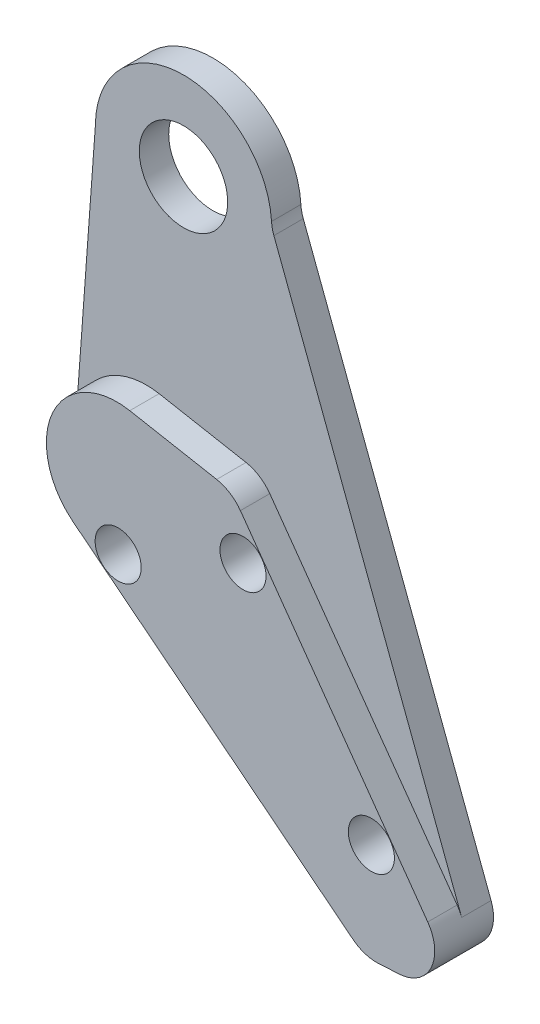
ISO-10303-21;
HEADER;
FILE_DESCRIPTION(('STEP AP214'),'2;1');
FILE_NAME('part.step','',(''),(''),'','','');
FILE_SCHEMA(('AUTOMOTIVE_DESIGN { 1 0 10303 214 1 1 1 1 }'));
ENDSEC;
DATA;
#1=APPLICATION_CONTEXT('core data for automotive mechanical design processes');
#2=APPLICATION_PROTOCOL_DEFINITION('international standard','automotive_design',2000,#1);
#3=PRODUCT_CONTEXT('',#1,'mechanical');
#4=PRODUCT('Part','Part','',(#3));
#5=PRODUCT_RELATED_PRODUCT_CATEGORY('part','',(#4));
#6=PRODUCT_DEFINITION_FORMATION('','',#4);
#7=PRODUCT_DEFINITION_CONTEXT('part definition',#1,'design');
#8=PRODUCT_DEFINITION('design','',#6,#7);
#9=PRODUCT_DEFINITION_SHAPE('','',#8);
#10=(LENGTH_UNIT() NAMED_UNIT(*) SI_UNIT(.MILLI.,.METRE.));
#11=(NAMED_UNIT(*) PLANE_ANGLE_UNIT() SI_UNIT($,.RADIAN.));
#12=(NAMED_UNIT(*) SI_UNIT($,.STERADIAN.) SOLID_ANGLE_UNIT());
#13=UNCERTAINTY_MEASURE_WITH_UNIT(LENGTH_MEASURE(1.E-05),#10,'distance_accuracy_value','');
#14=(GEOMETRIC_REPRESENTATION_CONTEXT(3) GLOBAL_UNCERTAINTY_ASSIGNED_CONTEXT((#13)) GLOBAL_UNIT_ASSIGNED_CONTEXT((#10,
#11,#12)) REPRESENTATION_CONTEXT('',''));
#15=CARTESIAN_POINT('',(0.,0.,0.));
#16=DIRECTION('',(0.,0.,1.));
#17=DIRECTION('',(1.,0.,0.));
#18=AXIS2_PLACEMENT_3D('',#15,#16,#17);
#19=CARTESIAN_POINT('',(66.6622604325006,359.5194560744,3.175));
#20=DIRECTION('',(-0.182312910473785,-0.983240561955505,0.));
#21=DIRECTION('',(0.983240561955505,-0.182312910473785,0.));
#22=AXIS2_PLACEMENT_3D('',#19,#20,#21);
#23=PLANE('',#22);
#24=DIRECTION('',(-0.983240561955505,0.182312910473785,0.));
#25=VECTOR('',#24,1.);
#26=CARTESIAN_POINT('',(66.6622604325006,359.5194560744,3.175));
#27=LINE('',#26,#25);
#28=CARTESIAN_POINT('',(355.83164898947,305.901537034429,3.175));
#29=VERTEX_POINT('',#28);
#30=CARTESIAN_POINT('',(346.443481491415,307.642295305408,3.175));
#31=VERTEX_POINT('',#30);
#32=EDGE_CURVE('E194',#29,#31,#27,.T.);
#33=ORIENTED_EDGE('',*,*,#32,.F.);
#34=DIRECTION('',(0.,0.,-1.));
#35=VECTOR('',#34,1.);
#36=CARTESIAN_POINT('',(355.83164898947,305.901537034429,3.175));
#37=LINE('',#36,#35);
#38=CARTESIAN_POINT('',(355.83164898947,305.901537034429,0.));
#39=VERTEX_POINT('',#38);
#40=EDGE_CURVE('E220',#29,#39,#37,.T.);
#41=ORIENTED_EDGE('',*,*,#40,.T.);
#42=DIRECTION('',(-0.983240561955505,0.182312910473785,0.));
#43=VECTOR('',#42,1.);
#44=CARTESIAN_POINT('',(66.6622604325006,359.5194560744,0.));
#45=LINE('',#44,#43);
#46=CARTESIAN_POINT('',(346.443481491415,307.642295305408,0.));
#47=VERTEX_POINT('',#46);
#48=EDGE_CURVE('E146',#39,#47,#45,.T.);
#49=ORIENTED_EDGE('',*,*,#48,.T.);
#50=DIRECTION('',(0.,0.,-1.));
#51=VECTOR('',#50,1.);
#52=CARTESIAN_POINT('',(346.443481491415,307.642295305408,3.175));
#53=LINE('',#52,#51);
#54=EDGE_CURVE('E217',#31,#47,#53,.T.);
#55=ORIENTED_EDGE('',*,*,#54,.F.);
#56=EDGE_LOOP('',(#33,#41,#49,#55));
#57=FACE_BOUND('',#56,.T.);
#58=ADVANCED_FACE('F37',(#57),#23,.F.);
#59=CARTESIAN_POINT('',(345.054257113605,300.150002223307,3.175));
#60=DIRECTION('',(0.,0.,-1.));
#61=DIRECTION('',(-1.,0.,0.));
#62=AXIS2_PLACEMENT_3D('',#59,#60,#61);
#63=CYLINDRICAL_SURFACE('',#62,7.61999999999995);
#64=CARTESIAN_POINT('',(345.054257113605,300.150002223307,0.));
#65=DIRECTION('',(0.,0.,1.));
#66=DIRECTION('',(1.,0.,0.));
#67=AXIS2_PLACEMENT_3D('',#64,#65,#66);
#68=CIRCLE('',#67,7.61999999999995);
#69=CARTESIAN_POINT('',(337.454724492493,300.708127604065,0.));
#70=VERTEX_POINT('',#69);
#71=EDGE_CURVE('E211',#47,#70,#68,.T.);
#72=ORIENTED_EDGE('',*,*,#71,.T.);
#73=DIRECTION('',(0.,0.,1.));
#74=VECTOR('',#73,1.);
#75=CARTESIAN_POINT('',(337.454724492493,300.708127604065,-3.175));
#76=LINE('',#75,#74);
#77=CARTESIAN_POINT('',(337.454724492493,300.708127604065,-3.175));
#78=VERTEX_POINT('',#77);
#79=EDGE_CURVE('E147',#78,#70,#76,.T.);
#80=ORIENTED_EDGE('',*,*,#79,.F.);
#81=CARTESIAN_POINT('',(345.054257113605,300.150002223307,-3.175));
#82=DIRECTION('',(0.,0.,-1.));
#83=DIRECTION('',(-1.,0.,0.));
#84=AXIS2_PLACEMENT_3D('',#81,#82,#83);
#85=CIRCLE('',#84,7.61999999999995);
#86=CARTESIAN_POINT('',(340.323801551131,294.176126582531,-3.175));
#87=VERTEX_POINT('',#86);
#88=EDGE_CURVE('E176',#87,#78,#85,.T.);
#89=ORIENTED_EDGE('',*,*,#88,.F.);
#90=DIRECTION('',(0.,0.,-1.));
#91=VECTOR('',#90,1.);
#92=CARTESIAN_POINT('',(340.323801551131,294.176126582531,3.175));
#93=LINE('',#92,#91);
#94=CARTESIAN_POINT('',(340.323801551131,294.176126582531,3.175));
#95=VERTEX_POINT('',#94);
#96=EDGE_CURVE('E208',#95,#87,#93,.T.);
#97=ORIENTED_EDGE('',*,*,#96,.F.);
#98=CARTESIAN_POINT('',(345.054257113605,300.150002223307,3.175));
#99=DIRECTION('',(0.,0.,1.));
#100=DIRECTION('',(1.,0.,0.));
#101=AXIS2_PLACEMENT_3D('',#98,#99,#100);
#102=CIRCLE('',#101,7.61999999999995);
#103=EDGE_CURVE('E196',#31,#95,#102,.T.);
#104=ORIENTED_EDGE('',*,*,#103,.F.);
#105=ORIENTED_EDGE('',*,*,#54,.T.);
#106=EDGE_LOOP('',(#72,#80,#89,#97,#104,#105));
#107=FACE_BOUND('',#106,.T.);
#108=ADVANCED_FACE('F274',(#107),#63,.T.);
#109=CARTESIAN_POINT('',(274.327563220316,346.435713404767,3.175));
#110=DIRECTION('',(-0.620794693238081,-0.783973181204202,0.));
#111=DIRECTION('',(0.783973181204202,-0.620794693238081,0.));
#112=AXIS2_PLACEMENT_3D('',#109,#110,#111);
#113=PLANE('',#112);
#114=ORIENTED_EDGE('',*,*,#96,.T.);
#115=DIRECTION('',(-0.783973181204203,0.620794693238081,0.));
#116=VECTOR('',#115,1.);
#117=CARTESIAN_POINT('',(274.327563220316,346.435713404767,-3.175));
#118=LINE('',#117,#116);
#119=CARTESIAN_POINT('',(370.573160939073,270.222957989389,-3.175));
#120=VERTEX_POINT('',#119);
#121=EDGE_CURVE('E173',#120,#87,#118,.T.);
#122=ORIENTED_EDGE('',*,*,#121,.F.);
#123=DIRECTION('',(0.,0.,-1.));
#124=VECTOR('',#123,1.);
#125=CARTESIAN_POINT('',(370.573160939073,270.222957989389,3.175));
#126=LINE('',#125,#124);
#127=CARTESIAN_POINT('',(370.573160939073,270.222957989389,3.175));
#128=VERTEX_POINT('',#127);
#129=EDGE_CURVE('E241',#120,#128,#126,.F.);
#130=ORIENTED_EDGE('',*,*,#129,.T.);
#131=DIRECTION('',(-0.783973181204202,0.620794693238081,0.));
#132=VECTOR('',#131,1.);
#133=CARTESIAN_POINT('',(274.327563220316,346.435713404767,3.175));
#134=LINE('',#133,#132);
#135=EDGE_CURVE('E200',#128,#95,#134,.T.);
#136=ORIENTED_EDGE('',*,*,#135,.T.);
#137=EDGE_LOOP('',(#114,#122,#130,#136));
#138=FACE_BOUND('',#137,.T.);
#139=ADVANCED_FACE('F280',(#138),#113,.T.);
#140=CARTESIAN_POINT('',(-14.1819989275817,247.112078193795,3.175));
#141=DIRECTION('',(-0.0572966760156146,0.998357196056382,0.));
#142=DIRECTION('',(-0.998357196056382,-0.0572966760156146,0.));
#143=AXIS2_PLACEMENT_3D('',#140,#141,#142);
#144=PLANE('',#143);
#145=DIRECTION('',(0.998357196056382,0.0572966760156146,0.));
#146=VECTOR('',#145,1.);
#147=CARTESIAN_POINT('',(-14.1819989275817,247.112078193795,3.175));
#148=LINE('',#147,#146);
#149=CARTESIAN_POINT('',(373.32892426372,269.35170135303,3.175));
#150=VERTEX_POINT('',#149);
#151=CARTESIAN_POINT('',(375.564558347033,269.48000653505,3.175));
#152=VERTEX_POINT('',#151);
#153=EDGE_CURVE('E202',#150,#152,#148,.T.);
#154=ORIENTED_EDGE('',*,*,#153,.F.);
#155=DIRECTION('',(0.,0.,-1.));
#156=VECTOR('',#155,1.);
#157=CARTESIAN_POINT('',(373.32892426372,269.35170135303,0.));
#158=LINE('',#157,#156);
#159=CARTESIAN_POINT('',(373.32892426372,269.35170135303,-3.175));
#160=VERTEX_POINT('',#159);
#161=EDGE_CURVE('E239',#150,#160,#158,.T.);
#162=ORIENTED_EDGE('',*,*,#161,.T.);
#163=DIRECTION('',(-0.998357196056382,-0.0572966760156146,0.));
#164=VECTOR('',#163,1.);
#165=CARTESIAN_POINT('',(-14.1819989275817,247.112078193795,-3.175));
#166=LINE('',#165,#164);
#167=CARTESIAN_POINT('',(375.564558347033,269.48000653505,-3.175));
#168=VERTEX_POINT('',#167);
#169=EDGE_CURVE('E156',#168,#160,#166,.T.);
#170=ORIENTED_EDGE('',*,*,#169,.F.);
#171=DIRECTION('',(0.,0.,-1.));
#172=VECTOR('',#171,1.);
#173=CARTESIAN_POINT('',(375.564558347033,269.48000653505,3.175));
#174=LINE('',#173,#172);
#175=EDGE_CURVE('E153',#168,#152,#174,.F.);
#176=ORIENTED_EDGE('',*,*,#175,.T.);
#177=EDGE_LOOP('',(#154,#162,#170,#176));
#178=FACE_BOUND('',#177,.T.);
#179=ADVANCED_FACE('F323',(#178),#144,.F.);
#180=CARTESIAN_POINT('',(381.351836094849,272.096968274889,3.175));
#181=DIRECTION('',(-0.814033418596933,-0.580818038121571,0.));
#182=DIRECTION('',(0.580818038121571,-0.814033418596933,0.));
#183=AXIS2_PLACEMENT_3D('',#180,#181,#182);
#184=PLANE('',#183);
#185=DIRECTION('',(-0.580818038121571,0.814033418596933,0.));
#186=VECTOR('',#185,1.);
#187=CARTESIAN_POINT('',(381.351836094849,272.096968274889,0.));
#188=LINE('',#187,#186);
#189=CARTESIAN_POINT('',(378.639936468883,275.897774686749,0.));
#190=VERTEX_POINT('',#189);
#191=CARTESIAN_POINT('',(358.398961134483,304.266091897568,0.));
#192=VERTEX_POINT('',#191);
#193=EDGE_CURVE('E197',#190,#192,#188,.T.);
#194=ORIENTED_EDGE('',*,*,#193,.T.);
#195=DIRECTION('',(0.,0.,-1.));
#196=VECTOR('',#195,1.);
#197=CARTESIAN_POINT('',(358.398961134483,304.266091897568,3.175));
#198=LINE('',#197,#196);
#199=CARTESIAN_POINT('',(358.398961134483,304.266091897568,3.175));
#200=VERTEX_POINT('',#199);
#201=EDGE_CURVE('E230',#192,#200,#198,.F.);
#202=ORIENTED_EDGE('',*,*,#201,.T.);
#203=DIRECTION('',(-0.580818038121571,0.814033418596933,0.));
#204=VECTOR('',#203,1.);
#205=CARTESIAN_POINT('',(381.351836094849,272.096968274889,3.175));
#206=LINE('',#205,#204);
#207=CARTESIAN_POINT('',(378.639936468883,275.897774686749,3.175));
#208=VERTEX_POINT('',#207);
#209=EDGE_CURVE('E205',#208,#200,#206,.T.);
#210=ORIENTED_EDGE('',*,*,#209,.F.);
#211=DIRECTION('',(0.,0.,-1.));
#212=VECTOR('',#211,1.);
#213=CARTESIAN_POINT('',(378.639936468883,275.897774686749,3.175));
#214=LINE('',#213,#212);
#215=EDGE_CURVE('E227',#208,#190,#214,.T.);
#216=ORIENTED_EDGE('',*,*,#215,.T.);
#217=EDGE_LOOP('',(#194,#202,#210,#216));
#218=FACE_BOUND('',#217,.T.);
#219=ADVANCED_FACE('F319',(#218),#184,.F.);
#220=CARTESIAN_POINT('',(0.,0.,3.175));
#221=DIRECTION('',(0.,0.,1.));
#222=DIRECTION('',(1.,0.,0.));
#223=AXIS2_PLACEMENT_3D('',#220,#221,#222);
#224=PLANE('',#223);
#225=CARTESIAN_POINT('',(358.677915578042,299.501986691275,3.175));
#226=DIRECTION('',(0.,0.,1.));
#227=DIRECTION('',(1.,0.,0.));
#228=AXIS2_PLACEMENT_3D('',#225,#226,#227);
#229=CIRCLE('',#228,2.48920000000001);
#230=CARTESIAN_POINT('',(361.167115578042,299.501986691275,3.175));
#231=VERTEX_POINT('',#230);
#232=EDGE_CURVE('E459',#231,#231,#229,.T.);
#233=ORIENTED_EDGE('',*,*,#232,.F.);
#234=EDGE_LOOP('',(#233));
#235=FACE_BOUND('',#234,.T.);
#236=CARTESIAN_POINT('',(372.548956234398,280.061318695652,3.175));
#237=DIRECTION('',(0.,0.,1.));
#238=DIRECTION('',(1.,0.,0.));
#239=AXIS2_PLACEMENT_3D('',#236,#237,#238);
#240=CIRCLE('',#239,2.48920000000001);
#241=CARTESIAN_POINT('',(375.038156234398,280.061318695652,3.175));
#242=VERTEX_POINT('',#241);
#243=EDGE_CURVE('E464',#242,#242,#240,.T.);
#244=ORIENTED_EDGE('',*,*,#243,.F.);
#245=EDGE_LOOP('',(#244));
#246=FACE_BOUND('',#245,.T.);
#247=CARTESIAN_POINT('',(345.192347420864,293.560840943581,3.175));
#248=DIRECTION('',(0.,0.,1.));
#249=DIRECTION('',(1.,0.,0.));
#250=AXIS2_PLACEMENT_3D('',#247,#248,#249);
#251=CIRCLE('',#250,2.48920000000001);
#252=CARTESIAN_POINT('',(347.681547420864,293.560840943581,3.175));
#253=VERTEX_POINT('',#252);
#254=EDGE_CURVE('E166',#253,#253,#251,.T.);
#255=ORIENTED_EDGE('',*,*,#254,.F.);
#256=EDGE_LOOP('',(#255));
#257=FACE_BOUND('',#256,.T.);
#258=ORIENTED_EDGE('',*,*,#209,.T.);
#259=CARTESIAN_POINT('',(355.090729321305,301.905647390642,3.175));
#260=DIRECTION('',(0.,0.,1.));
#261=DIRECTION('',(1.,0.,0.));
#262=AXIS2_PLACEMENT_3D('',#259,#260,#261);
#263=CIRCLE('',#262,4.064);
#264=EDGE_CURVE('E236',#200,#29,#263,.T.);
#265=ORIENTED_EDGE('',*,*,#264,.T.);
#266=ORIENTED_EDGE('',*,*,#32,.T.);
#267=ORIENTED_EDGE('',*,*,#103,.T.);
#268=ORIENTED_EDGE('',*,*,#135,.F.);
#269=CARTESIAN_POINT('',(373.096070572392,273.409024997803,3.175));
#270=DIRECTION('',(0.,0.,1.));
#271=DIRECTION('',(1.,0.,0.));
#272=AXIS2_PLACEMENT_3D('',#269,#270,#271);
#273=CIRCLE('',#272,4.064);
#274=EDGE_CURVE('E234',#128,#150,#273,.T.);
#275=ORIENTED_EDGE('',*,*,#274,.T.);
#276=ORIENTED_EDGE('',*,*,#153,.T.);
#277=CARTESIAN_POINT('',(375.331704655705,273.537330179823,3.175));
#278=DIRECTION('',(0.,0.,1.));
#279=DIRECTION('',(1.,0.,0.));
#280=AXIS2_PLACEMENT_3D('',#277,#278,#279);
#281=CIRCLE('',#280,4.064);
#282=EDGE_CURVE('E232',#152,#208,#281,.T.);
#283=ORIENTED_EDGE('',*,*,#282,.T.);
#284=EDGE_LOOP('',(#258,#265,#266,#267,#268,#275,#276,#283));
#285=FACE_BOUND('',#284,.T.);
#286=ADVANCED_FACE('F290',(#235,#246,#257,#285),#224,.T.);
#287=CARTESIAN_POINT('',(355.090729321305,301.905647390642,3.175));
#288=DIRECTION('',(0.,0.,-1.));
#289=DIRECTION('',(-1.,0.,0.));
#290=AXIS2_PLACEMENT_3D('',#287,#288,#289);
#291=CYLINDRICAL_SURFACE('',#290,4.064);
#292=ORIENTED_EDGE('',*,*,#264,.F.);
#293=ORIENTED_EDGE('',*,*,#201,.F.);
#294=CARTESIAN_POINT('',(355.090729321305,301.905647390642,0.));
#295=DIRECTION('',(0.,0.,1.));
#296=DIRECTION('',(1.,0.,0.));
#297=AXIS2_PLACEMENT_3D('',#294,#295,#296);
#298=CIRCLE('',#297,4.064);
#299=EDGE_CURVE('E225',#39,#192,#298,.F.);
#300=ORIENTED_EDGE('',*,*,#299,.F.);
#301=ORIENTED_EDGE('',*,*,#40,.F.);
#302=EDGE_LOOP('',(#292,#293,#300,#301));
#303=FACE_BOUND('',#302,.T.);
#304=ADVANCED_FACE('F286',(#303),#291,.T.);
#305=CARTESIAN_POINT('',(373.096070572392,273.409024997803,3.175));
#306=DIRECTION('',(0.,0.,1.));
#307=DIRECTION('',(1.,0.,0.));
#308=AXIS2_PLACEMENT_3D('',#305,#306,#307);
#309=CYLINDRICAL_SURFACE('',#308,4.064);
#310=ORIENTED_EDGE('',*,*,#274,.F.);
#311=ORIENTED_EDGE('',*,*,#129,.F.);
#312=CARTESIAN_POINT('',(373.096070572392,273.409024997803,-3.175));
#313=DIRECTION('',(0.,0.,-1.));
#314=DIRECTION('',(-1.,0.,0.));
#315=AXIS2_PLACEMENT_3D('',#312,#313,#314);
#316=CIRCLE('',#315,4.064);
#317=EDGE_CURVE('E170',#160,#120,#316,.T.);
#318=ORIENTED_EDGE('',*,*,#317,.F.);
#319=ORIENTED_EDGE('',*,*,#161,.F.);
#320=EDGE_LOOP('',(#310,#311,#318,#319));
#321=FACE_BOUND('',#320,.T.);
#322=ADVANCED_FACE('F289',(#321),#309,.T.);
#323=CARTESIAN_POINT('',(375.331704655705,273.537330179823,3.175));
#324=DIRECTION('',(0.,0.,-1.));
#325=DIRECTION('',(-1.,0.,0.));
#326=AXIS2_PLACEMENT_3D('',#323,#324,#325);
#327=CYLINDRICAL_SURFACE('',#326,4.064);
#328=ORIENTED_EDGE('',*,*,#282,.F.);
#329=ORIENTED_EDGE('',*,*,#175,.F.);
#330=CARTESIAN_POINT('',(375.331704655705,273.537330179823,-3.175));
#331=DIRECTION('',(0.,0.,-1.));
#332=DIRECTION('',(-1.,0.,0.));
#333=AXIS2_PLACEMENT_3D('',#330,#331,#332);
#334=CIRCLE('',#333,4.064);
#335=CARTESIAN_POINT('',(379.132945264584,274.97492046687,-3.175));
#336=VERTEX_POINT('',#335);
#337=EDGE_CURVE('E150',#336,#168,#334,.T.);
#338=ORIENTED_EDGE('',*,*,#337,.F.);
#339=DIRECTION('',(0.,0.,1.));
#340=VECTOR('',#339,1.);
#341=CARTESIAN_POINT('',(379.132945264584,274.97492046687,-3.175));
#342=LINE('',#341,#340);
#343=CARTESIAN_POINT('',(379.132945264584,274.97492046687,0.));
#344=VERTEX_POINT('',#343);
#345=EDGE_CURVE('E138',#336,#344,#342,.T.);
#346=ORIENTED_EDGE('',*,*,#345,.T.);
#347=CARTESIAN_POINT('',(375.331704655705,273.537330179823,0.));
#348=DIRECTION('',(0.,0.,1.));
#349=DIRECTION('',(1.,0.,0.));
#350=AXIS2_PLACEMENT_3D('',#347,#348,#349);
#351=CIRCLE('',#350,4.064);
#352=EDGE_CURVE('E223',#190,#344,#351,.F.);
#353=ORIENTED_EDGE('',*,*,#352,.F.);
#354=ORIENTED_EDGE('',*,*,#215,.F.);
#355=EDGE_LOOP('',(#328,#329,#338,#346,#353,#354));
#356=FACE_BOUND('',#355,.T.);
#357=ADVANCED_FACE('F152',(#356),#327,.T.);
#358=CARTESIAN_POINT('',(0.,0.,0.));
#359=DIRECTION('',(0.,0.,-1.));
#360=DIRECTION('',(-1.,0.,0.));
#361=AXIS2_PLACEMENT_3D('',#358,#359,#360);
#362=PLANE('',#361);
#363=CARTESIAN_POINT('',(349.076836415497,329.262769658404,0.));
#364=DIRECTION('',(0.,0.,-1.));
#365=DIRECTION('',(-1.,0.,0.));
#366=AXIS2_PLACEMENT_3D('',#363,#364,#365);
#367=CIRCLE('',#366,4.77519999999998);
#368=CARTESIAN_POINT('',(344.301636415497,329.262769658404,0.));
#369=VERTEX_POINT('',#368);
#370=EDGE_CURVE('E160',#369,#369,#367,.T.);
#371=ORIENTED_EDGE('',*,*,#370,.T.);
#372=EDGE_LOOP('',(#371));
#373=FACE_BOUND('',#372,.T.);
#374=ORIENTED_EDGE('',*,*,#193,.F.);
#375=ORIENTED_EDGE('',*,*,#352,.T.);
#376=DIRECTION('',(-0.353737767482172,0.935344638011428,0.));
#377=VECTOR('',#376,1.);
#378=CARTESIAN_POINT('',(422.671936221158,159.850199616382,0.));
#379=LINE('',#378,#377);
#380=CARTESIAN_POINT('',(358.840666954011,328.631259867459,0.));
#381=VERTEX_POINT('',#380);
#382=EDGE_CURVE('E143',#344,#381,#379,.T.);
#383=ORIENTED_EDGE('',*,*,#382,.T.);
#384=CARTESIAN_POINT('',(362.641907562889,330.068850154507,0.));
#385=DIRECTION('',(0.,0.,-1.));
#386=DIRECTION('',(-1.,0.,0.));
#387=AXIS2_PLACEMENT_3D('',#384,#385,#386);
#388=CIRCLE('',#387,4.064);
#389=CARTESIAN_POINT('',(358.585063855258,329.827779351934,0.));
#390=VERTEX_POINT('',#389);
#391=EDGE_CURVE('E45',#381,#390,#388,.T.);
#392=ORIENTED_EDGE('',*,*,#391,.T.);
#393=CARTESIAN_POINT('',(349.076836415497,329.262769658404,0.));
#394=DIRECTION('',(0.,0.,-1.));
#395=DIRECTION('',(-1.,0.,0.));
#396=AXIS2_PLACEMENT_3D('',#393,#394,#395);
#397=CIRCLE('',#396,9.52500000000002);
#398=CARTESIAN_POINT('',(339.552515105864,329.376473619938,0.));
#399=VERTEX_POINT('',#398);
#400=EDGE_CURVE('E163',#399,#390,#397,.T.);
#401=ORIENTED_EDGE('',*,*,#400,.F.);
#402=CARTESIAN_POINT('',(335.488804680421,329.424987310193,0.));
#403=DIRECTION('',(0.,0.,-1.));
#404=DIRECTION('',(-1.,0.,0.));
#405=AXIS2_PLACEMENT_3D('',#402,#403,#404);
#406=CIRCLE('',#405,4.064);
#407=CARTESIAN_POINT('',(339.541888745014,329.127320440455,0.));
#408=VERTEX_POINT('',#407);
#409=EDGE_CURVE('E252',#399,#408,#406,.T.);
#410=ORIENTED_EDGE('',*,*,#409,.T.);
#411=DIRECTION('',(-0.0732448006244585,-0.997313992271984,0.));
#412=VECTOR('',#411,1.);
#413=CARTESIAN_POINT('',(313.678200402227,-23.0371752795325,0.));
#414=LINE('',#413,#412);
#415=EDGE_CURVE('E187',#408,#70,#414,.T.);
#416=ORIENTED_EDGE('',*,*,#415,.T.);
#417=ORIENTED_EDGE('',*,*,#71,.F.);
#418=ORIENTED_EDGE('',*,*,#48,.F.);
#419=ORIENTED_EDGE('',*,*,#299,.T.);
#420=EDGE_LOOP('',(#374,#375,#383,#392,#401,#410,#416,#417,#418,#419));
#421=FACE_BOUND('',#420,.T.);
#422=ADVANCED_FACE('F257',(#373,#421),#362,.F.);
#423=CARTESIAN_POINT('',(422.671936221158,159.850199616382,-3.175));
#424=DIRECTION('',(0.935344638011428,0.353737767482172,0.));
#425=DIRECTION('',(-0.353737767482172,0.935344638011428,0.));
#426=AXIS2_PLACEMENT_3D('',#423,#424,#425);
#427=PLANE('',#426);
#428=DIRECTION('',(-0.353737767482172,0.935344638011428,0.));
#429=VECTOR('',#428,1.);
#430=CARTESIAN_POINT('',(422.671936221158,159.850199616382,-3.175));
#431=LINE('',#430,#429);
#432=CARTESIAN_POINT('',(358.840666954011,328.631259867459,-3.175));
#433=VERTEX_POINT('',#432);
#434=EDGE_CURVE('E141',#336,#433,#431,.T.);
#435=ORIENTED_EDGE('',*,*,#434,.T.);
#436=DIRECTION('',(0.,0.,1.));
#437=VECTOR('',#436,1.);
#438=CARTESIAN_POINT('',(358.840666954011,328.631259867459,-3.175));
#439=LINE('',#438,#437);
#440=EDGE_CURVE('E250',#433,#381,#439,.T.);
#441=ORIENTED_EDGE('',*,*,#440,.T.);
#442=ORIENTED_EDGE('',*,*,#382,.F.);
#443=ORIENTED_EDGE('',*,*,#345,.F.);
#444=EDGE_LOOP('',(#435,#441,#442,#443));
#445=FACE_BOUND('',#444,.T.);
#446=ADVANCED_FACE('F140',(#445),#427,.T.);
#447=CARTESIAN_POINT('',(313.678200402227,-23.0371752795325,-3.175));
#448=DIRECTION('',(-0.997313992271984,0.0732448006244585,0.));
#449=DIRECTION('',(-0.0732448006244585,-0.997313992271984,0.));
#450=AXIS2_PLACEMENT_3D('',#447,#448,#449);
#451=PLANE('',#450);
#452=ORIENTED_EDGE('',*,*,#415,.F.);
#453=DIRECTION('',(0.,0.,1.));
#454=VECTOR('',#453,1.);
#455=CARTESIAN_POINT('',(339.541888745014,329.127320440455,-3.175));
#456=LINE('',#455,#454);
#457=CARTESIAN_POINT('',(339.541888745014,329.127320440455,-3.175));
#458=VERTEX_POINT('',#457);
#459=EDGE_CURVE('E248',#408,#458,#456,.F.);
#460=ORIENTED_EDGE('',*,*,#459,.T.);
#461=DIRECTION('',(-0.0732448006244585,-0.997313992271984,0.));
#462=VECTOR('',#461,1.);
#463=CARTESIAN_POINT('',(313.678200402227,-23.0371752795325,-3.175));
#464=LINE('',#463,#462);
#465=EDGE_CURVE('E179',#458,#78,#464,.T.);
#466=ORIENTED_EDGE('',*,*,#465,.T.);
#467=ORIENTED_EDGE('',*,*,#79,.T.);
#468=EDGE_LOOP('',(#452,#460,#466,#467));
#469=FACE_BOUND('',#468,.T.);
#470=ADVANCED_FACE('F304',(#469),#451,.T.);
#471=CARTESIAN_POINT('',(349.076836415497,329.262769658404,-3.175));
#472=DIRECTION('',(0.,0.,1.));
#473=DIRECTION('',(1.,0.,0.));
#474=AXIS2_PLACEMENT_3D('',#471,#472,#473);
#475=CYLINDRICAL_SURFACE('',#474,9.52500000000002);
#476=CARTESIAN_POINT('',(349.076836415497,329.262769658404,-3.175));
#477=DIRECTION('',(0.,0.,-1.));
#478=DIRECTION('',(-1.,0.,0.));
#479=AXIS2_PLACEMENT_3D('',#476,#477,#478);
#480=CIRCLE('',#479,9.52500000000002);
#481=CARTESIAN_POINT('',(339.552515105864,329.376473619938,-3.175));
#482=VERTEX_POINT('',#481);
#483=CARTESIAN_POINT('',(358.585063855258,329.827779351934,-3.175));
#484=VERTEX_POINT('',#483);
#485=EDGE_CURVE('E181',#482,#484,#480,.T.);
#486=ORIENTED_EDGE('',*,*,#485,.F.);
#487=DIRECTION('',(0.,0.,1.));
#488=VECTOR('',#487,1.);
#489=CARTESIAN_POINT('',(339.552515105864,329.376473619938,-3.175));
#490=LINE('',#489,#488);
#491=EDGE_CURVE('E245',#482,#399,#490,.T.);
#492=ORIENTED_EDGE('',*,*,#491,.T.);
#493=ORIENTED_EDGE('',*,*,#400,.T.);
#494=DIRECTION('',(0.,0.,1.));
#495=VECTOR('',#494,1.);
#496=CARTESIAN_POINT('',(358.585063855258,329.827779351934,-3.175));
#497=LINE('',#496,#495);
#498=EDGE_CURVE('E243',#390,#484,#497,.F.);
#499=ORIENTED_EDGE('',*,*,#498,.T.);
#500=EDGE_LOOP('',(#486,#492,#493,#499));
#501=FACE_BOUND('',#500,.T.);
#502=ADVANCED_FACE('F260',(#501),#475,.T.);
#503=CARTESIAN_POINT('',(349.076836415497,329.262769658404,-3.175));
#504=DIRECTION('',(0.,0.,1.));
#505=DIRECTION('',(1.,0.,0.));
#506=AXIS2_PLACEMENT_3D('',#503,#504,#505);
#507=CYLINDRICAL_SURFACE('',#506,4.77519999999998);
#508=CARTESIAN_POINT('',(349.076836415497,329.262769658404,-3.175));
#509=DIRECTION('',(0.,0.,-1.));
#510=DIRECTION('',(-1.,0.,0.));
#511=AXIS2_PLACEMENT_3D('',#508,#509,#510);
#512=CIRCLE('',#511,4.77519999999998);
#513=CARTESIAN_POINT('',(344.301636415497,329.262769658404,-3.175));
#514=VERTEX_POINT('',#513);
#515=EDGE_CURVE('E183',#514,#514,#512,.T.);
#516=ORIENTED_EDGE('',*,*,#515,.T.);
#517=EDGE_LOOP('',(#516));
#518=FACE_BOUND('',#517,.T.);
#519=ORIENTED_EDGE('',*,*,#370,.F.);
#520=EDGE_LOOP('',(#519));
#521=FACE_BOUND('',#520,.T.);
#522=ADVANCED_FACE('F308',(#518,#521),#507,.F.);
#523=CARTESIAN_POINT('',(0.,0.,-3.175));
#524=DIRECTION('',(0.,0.,-1.));
#525=DIRECTION('',(-1.,0.,0.));
#526=AXIS2_PLACEMENT_3D('',#523,#524,#525);
#527=PLANE('',#526);
#528=CARTESIAN_POINT('',(358.677915578042,299.501986691275,-3.175));
#529=DIRECTION('',(0.,0.,1.));
#530=DIRECTION('',(1.,0.,0.));
#531=AXIS2_PLACEMENT_3D('',#528,#529,#530);
#532=CIRCLE('',#531,2.48920000000001);
#533=CARTESIAN_POINT('',(361.167115578042,299.501986691275,-3.175));
#534=VERTEX_POINT('',#533);
#535=EDGE_CURVE('E188',#534,#534,#532,.T.);
#536=ORIENTED_EDGE('',*,*,#535,.T.);
#537=EDGE_LOOP('',(#536));
#538=FACE_BOUND('',#537,.T.);
#539=CARTESIAN_POINT('',(372.548956234398,280.061318695652,-3.175));
#540=DIRECTION('',(0.,0.,1.));
#541=DIRECTION('',(1.,0.,0.));
#542=AXIS2_PLACEMENT_3D('',#539,#540,#541);
#543=CIRCLE('',#542,2.48920000000001);
#544=CARTESIAN_POINT('',(375.038156234398,280.061318695652,-3.175));
#545=VERTEX_POINT('',#544);
#546=EDGE_CURVE('E460',#545,#545,#543,.T.);
#547=ORIENTED_EDGE('',*,*,#546,.T.);
#548=EDGE_LOOP('',(#547));
#549=FACE_BOUND('',#548,.T.);
#550=CARTESIAN_POINT('',(345.192347420864,293.560840943581,-3.175));
#551=DIRECTION('',(0.,0.,1.));
#552=DIRECTION('',(1.,0.,0.));
#553=AXIS2_PLACEMENT_3D('',#550,#551,#552);
#554=CIRCLE('',#553,2.48920000000001);
#555=CARTESIAN_POINT('',(347.681547420864,293.560840943581,-3.175));
#556=VERTEX_POINT('',#555);
#557=EDGE_CURVE('E468',#556,#556,#554,.T.);
#558=ORIENTED_EDGE('',*,*,#557,.T.);
#559=EDGE_LOOP('',(#558));
#560=FACE_BOUND('',#559,.T.);
#561=ORIENTED_EDGE('',*,*,#434,.F.);
#562=ORIENTED_EDGE('',*,*,#337,.T.);
#563=ORIENTED_EDGE('',*,*,#169,.T.);
#564=ORIENTED_EDGE('',*,*,#317,.T.);
#565=ORIENTED_EDGE('',*,*,#121,.T.);
#566=ORIENTED_EDGE('',*,*,#88,.T.);
#567=ORIENTED_EDGE('',*,*,#465,.F.);
#568=CARTESIAN_POINT('',(335.488804680421,329.424987310193,-3.175));
#569=DIRECTION('',(0.,0.,-1.));
#570=DIRECTION('',(-1.,0.,0.));
#571=AXIS2_PLACEMENT_3D('',#568,#569,#570);
#572=CIRCLE('',#571,4.064);
#573=EDGE_CURVE('E254',#458,#482,#572,.F.);
#574=ORIENTED_EDGE('',*,*,#573,.T.);
#575=ORIENTED_EDGE('',*,*,#485,.T.);
#576=CARTESIAN_POINT('',(362.641907562889,330.068850154507,-3.175));
#577=DIRECTION('',(0.,0.,-1.));
#578=DIRECTION('',(-1.,0.,0.));
#579=AXIS2_PLACEMENT_3D('',#576,#577,#578);
#580=CIRCLE('',#579,4.064);
#581=EDGE_CURVE('E11',#484,#433,#580,.F.);
#582=ORIENTED_EDGE('',*,*,#581,.T.);
#583=EDGE_LOOP('',(#561,#562,#563,#564,#565,#566,#567,#574,#575,#582));
#584=FACE_BOUND('',#583,.T.);
#585=ORIENTED_EDGE('',*,*,#515,.F.);
#586=EDGE_LOOP('',(#585));
#587=FACE_BOUND('',#586,.T.);
#588=ADVANCED_FACE('F158',(#538,#549,#560,#584,#587),#527,.T.);
#589=CARTESIAN_POINT('',(335.488804680421,329.424987310193,-3.175));
#590=DIRECTION('',(0.,0.,1.));
#591=DIRECTION('',(1.,0.,0.));
#592=AXIS2_PLACEMENT_3D('',#589,#590,#591);
#593=CYLINDRICAL_SURFACE('',#592,4.064);
#594=ORIENTED_EDGE('',*,*,#573,.F.);
#595=ORIENTED_EDGE('',*,*,#459,.F.);
#596=ORIENTED_EDGE('',*,*,#409,.F.);
#597=ORIENTED_EDGE('',*,*,#491,.F.);
#598=EDGE_LOOP('',(#594,#595,#596,#597));
#599=FACE_BOUND('',#598,.T.);
#600=ADVANCED_FACE('F264',(#599),#593,.F.);
#601=CARTESIAN_POINT('',(362.641907562889,330.068850154507,-3.175));
#602=DIRECTION('',(0.,0.,1.));
#603=DIRECTION('',(1.,0.,0.));
#604=AXIS2_PLACEMENT_3D('',#601,#602,#603);
#605=CYLINDRICAL_SURFACE('',#604,4.064);
#606=ORIENTED_EDGE('',*,*,#581,.F.);
#607=ORIENTED_EDGE('',*,*,#498,.F.);
#608=ORIENTED_EDGE('',*,*,#391,.F.);
#609=ORIENTED_EDGE('',*,*,#440,.F.);
#610=EDGE_LOOP('',(#606,#607,#608,#609));
#611=FACE_BOUND('',#610,.T.);
#612=ADVANCED_FACE('F39',(#611),#605,.F.);
#613=CARTESIAN_POINT('',(345.192347420864,293.560840943581,-3.175));
#614=DIRECTION('',(0.,0.,1.));
#615=DIRECTION('',(1.,0.,0.));
#616=AXIS2_PLACEMENT_3D('',#613,#614,#615);
#617=CYLINDRICAL_SURFACE('',#616,2.48920000000001);
#618=ORIENTED_EDGE('',*,*,#557,.F.);
#619=EDGE_LOOP('',(#618));
#620=FACE_BOUND('',#619,.T.);
#621=ORIENTED_EDGE('',*,*,#254,.T.);
#622=EDGE_LOOP('',(#621));
#623=FACE_BOUND('',#622,.T.);
#624=ADVANCED_FACE('F263',(#620,#623),#617,.F.);
#625=CARTESIAN_POINT('',(372.548956234398,280.061318695652,-3.175));
#626=DIRECTION('',(0.,0.,1.));
#627=DIRECTION('',(1.,0.,0.));
#628=AXIS2_PLACEMENT_3D('',#625,#626,#627);
#629=CYLINDRICAL_SURFACE('',#628,2.48920000000001);
#630=ORIENTED_EDGE('',*,*,#546,.F.);
#631=EDGE_LOOP('',(#630));
#632=FACE_BOUND('',#631,.T.);
#633=ORIENTED_EDGE('',*,*,#243,.T.);
#634=EDGE_LOOP('',(#633));
#635=FACE_BOUND('',#634,.T.);
#636=ADVANCED_FACE('F269',(#632,#635),#629,.F.);
#637=CARTESIAN_POINT('',(358.677915578042,299.501986691275,-3.175));
#638=DIRECTION('',(0.,0.,1.));
#639=DIRECTION('',(1.,0.,0.));
#640=AXIS2_PLACEMENT_3D('',#637,#638,#639);
#641=CYLINDRICAL_SURFACE('',#640,2.48920000000001);
#642=ORIENTED_EDGE('',*,*,#535,.F.);
#643=EDGE_LOOP('',(#642));
#644=FACE_BOUND('',#643,.T.);
#645=ORIENTED_EDGE('',*,*,#232,.T.);
#646=EDGE_LOOP('',(#645));
#647=FACE_BOUND('',#646,.T.);
#648=ADVANCED_FACE('F440',(#644,#647),#641,.F.);
#649=CLOSED_SHELL('',(#58,#108,#139,#179,#219,#286,#304,#322,#357,#422,#446,#470,#502,#522,#588,
#600,#612,#624,#636,#648));
#650=MANIFOLD_SOLID_BREP('B2',#649);
#651=ADVANCED_BREP_SHAPE_REPRESENTATION('',(#18,#650),#14);
#652=SHAPE_DEFINITION_REPRESENTATION(#9,#651);
ENDSEC;
END-ISO-10303-21;
